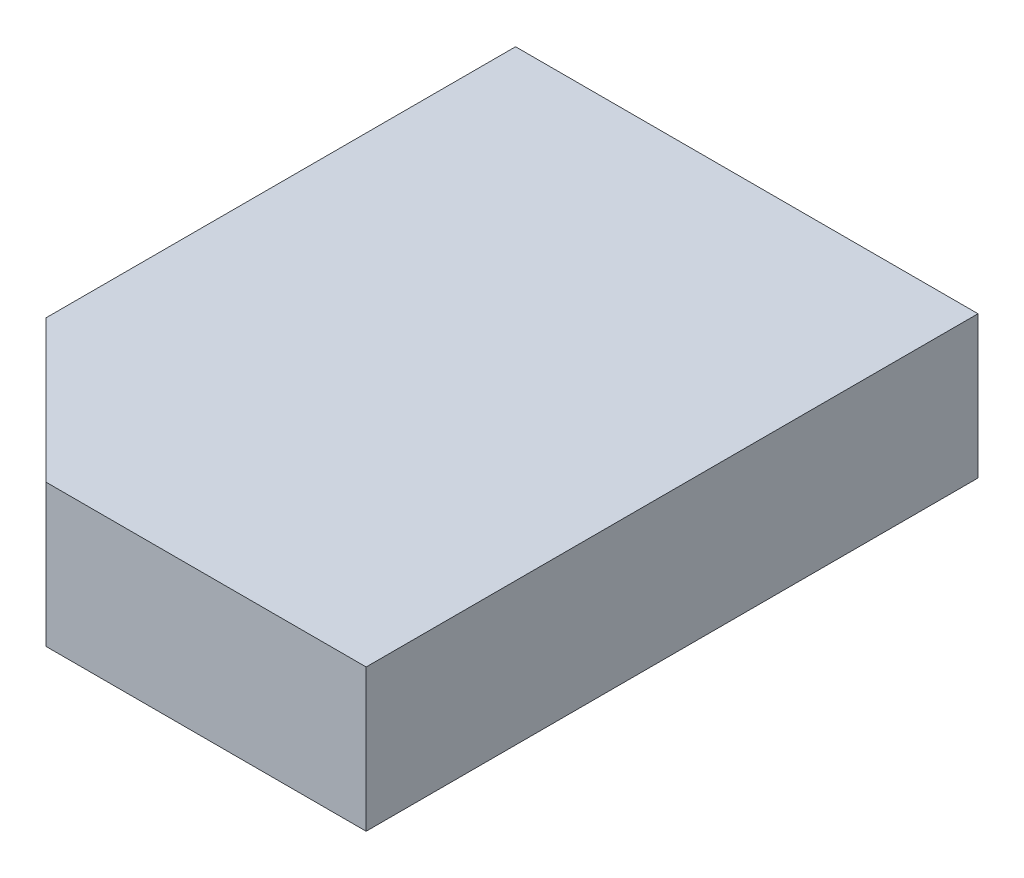
ISO-10303-21;
HEADER;
FILE_DESCRIPTION(('STEP AP214'),'2;1');
FILE_NAME('part.step','',(''),(''),'','','');
FILE_SCHEMA(('AUTOMOTIVE_DESIGN { 1 0 10303 214 1 1 1 1 }'));
ENDSEC;
DATA;
#1=APPLICATION_CONTEXT('core data for automotive mechanical design processes');
#2=APPLICATION_PROTOCOL_DEFINITION('international standard','automotive_design',2000,#1);
#3=PRODUCT_CONTEXT('',#1,'mechanical');
#4=PRODUCT('Part','Part','',(#3));
#5=PRODUCT_RELATED_PRODUCT_CATEGORY('part','',(#4));
#6=PRODUCT_DEFINITION_FORMATION('','',#4);
#7=PRODUCT_DEFINITION_CONTEXT('part definition',#1,'design');
#8=PRODUCT_DEFINITION('design','',#6,#7);
#9=PRODUCT_DEFINITION_SHAPE('','',#8);
#10=(LENGTH_UNIT() NAMED_UNIT(*) SI_UNIT(.MILLI.,.METRE.));
#11=(NAMED_UNIT(*) PLANE_ANGLE_UNIT() SI_UNIT($,.RADIAN.));
#12=(NAMED_UNIT(*) SI_UNIT($,.STERADIAN.) SOLID_ANGLE_UNIT());
#13=UNCERTAINTY_MEASURE_WITH_UNIT(LENGTH_MEASURE(1.E-05),#10,'distance_accuracy_value','');
#14=(GEOMETRIC_REPRESENTATION_CONTEXT(3) GLOBAL_UNCERTAINTY_ASSIGNED_CONTEXT((#13)) GLOBAL_UNIT_ASSIGNED_CONTEXT((#10,
#11,#12)) REPRESENTATION_CONTEXT('',''));
#15=CARTESIAN_POINT('',(0.,0.,0.));
#16=DIRECTION('',(0.,0.,1.));
#17=DIRECTION('',(1.,0.,0.));
#18=AXIS2_PLACEMENT_3D('',#15,#16,#17);
#19=CARTESIAN_POINT('',(5.8552,3.1756,-1.7));
#20=DIRECTION('',(0.,0.,1.));
#21=DIRECTION('',(1.,0.,0.));
#22=AXIS2_PLACEMENT_3D('',#19,#20,#21);
#23=PLANE('',#22);
#24=DIRECTION('',(-1.,0.,0.));
#25=VECTOR('',#24,1.);
#26=CARTESIAN_POINT('',(5.8552,2.9756,-1.7));
#27=LINE('',#26,#25);
#28=CARTESIAN_POINT('',(6.5052,2.9756,-1.7));
#29=VERTEX_POINT('',#28);
#30=CARTESIAN_POINT('',(5.8552,2.9756,-1.7));
#31=VERTEX_POINT('',#30);
#32=EDGE_CURVE('E11',#29,#31,#27,.T.);
#33=ORIENTED_EDGE('',*,*,#32,.T.);
#34=DIRECTION('',(0.,-1.,0.));
#35=VECTOR('',#34,1.);
#36=CARTESIAN_POINT('',(5.8552,3.1756,-1.7));
#37=LINE('',#36,#35);
#38=CARTESIAN_POINT('',(5.8552,3.1756,-1.7));
#39=VERTEX_POINT('',#38);
#40=EDGE_CURVE('E24',#39,#31,#37,.T.);
#41=ORIENTED_EDGE('',*,*,#40,.F.);
#42=DIRECTION('',(-1.,0.,0.));
#43=VECTOR('',#42,1.);
#44=CARTESIAN_POINT('',(5.8552,3.1756,-1.7));
#45=LINE('',#44,#43);
#46=CARTESIAN_POINT('',(6.5052,3.1756,-1.7));
#47=VERTEX_POINT('',#46);
#48=EDGE_CURVE('E102',#47,#39,#45,.T.);
#49=ORIENTED_EDGE('',*,*,#48,.F.);
#50=DIRECTION('',(0.,-1.,0.));
#51=VECTOR('',#50,1.);
#52=CARTESIAN_POINT('',(6.5052,3.1756,-1.7));
#53=LINE('',#52,#51);
#54=EDGE_CURVE('E84',#47,#29,#53,.T.);
#55=ORIENTED_EDGE('',*,*,#54,.T.);
#56=EDGE_LOOP('',(#33,#41,#49,#55));
#57=FACE_BOUND('',#56,.T.);
#58=ADVANCED_FACE('F17',(#57),#23,.F.);
#59=CARTESIAN_POINT('',(5.8552,3.1756,-1.04));
#60=DIRECTION('',(1.,0.,0.));
#61=DIRECTION('',(0.,0.,-1.));
#62=AXIS2_PLACEMENT_3D('',#59,#60,#61);
#63=PLANE('',#62);
#64=DIRECTION('',(0.,0.,1.));
#65=VECTOR('',#64,1.);
#66=CARTESIAN_POINT('',(5.8552,2.9756,-1.04));
#67=LINE('',#66,#65);
#68=CARTESIAN_POINT('',(5.8552,2.9756,-1.04));
#69=VERTEX_POINT('',#68);
#70=EDGE_CURVE('E99',#31,#69,#67,.T.);
#71=ORIENTED_EDGE('',*,*,#70,.T.);
#72=DIRECTION('',(0.,-1.,0.));
#73=VECTOR('',#72,1.);
#74=CARTESIAN_POINT('',(5.8552,3.1756,-1.04));
#75=LINE('',#74,#73);
#76=CARTESIAN_POINT('',(5.8552,3.1756,-1.04));
#77=VERTEX_POINT('',#76);
#78=EDGE_CURVE('E96',#77,#69,#75,.T.);
#79=ORIENTED_EDGE('',*,*,#78,.F.);
#80=DIRECTION('',(0.,0.,1.));
#81=VECTOR('',#80,1.);
#82=CARTESIAN_POINT('',(5.8552,3.1756,-1.04));
#83=LINE('',#82,#81);
#84=EDGE_CURVE('E94',#39,#77,#83,.T.);
#85=ORIENTED_EDGE('',*,*,#84,.F.);
#86=ORIENTED_EDGE('',*,*,#40,.T.);
#87=EDGE_LOOP('',(#71,#79,#85,#86));
#88=FACE_BOUND('',#87,.T.);
#89=ADVANCED_FACE('F105',(#88),#63,.F.);
#90=CARTESIAN_POINT('',(5.8552,3.1756,-1.04));
#91=DIRECTION('',(0.707106781186548,0.,-0.707106781186548));
#92=DIRECTION('',(-0.707106781186548,0.,-0.707106781186548));
#93=AXIS2_PLACEMENT_3D('',#90,#91,#92);
#94=PLANE('',#93);
#95=DIRECTION('',(0.707106781186548,0.,0.707106781186548));
#96=VECTOR('',#95,1.);
#97=CARTESIAN_POINT('',(5.8552,2.9756,-1.04));
#98=LINE('',#97,#96);
#99=CARTESIAN_POINT('',(6.0552,2.9756,-0.840000000000039));
#100=VERTEX_POINT('',#99);
#101=EDGE_CURVE('E92',#69,#100,#98,.T.);
#102=ORIENTED_EDGE('',*,*,#101,.T.);
#103=DIRECTION('',(0.,-1.,0.));
#104=VECTOR('',#103,1.);
#105=CARTESIAN_POINT('',(6.0552,3.1756,-0.840000000000039));
#106=LINE('',#105,#104);
#107=CARTESIAN_POINT('',(6.0552,3.1756,-0.840000000000039));
#108=VERTEX_POINT('',#107);
#109=EDGE_CURVE('E90',#108,#100,#106,.T.);
#110=ORIENTED_EDGE('',*,*,#109,.F.);
#111=DIRECTION('',(0.707106781186548,0.,0.707106781186548));
#112=VECTOR('',#111,1.);
#113=CARTESIAN_POINT('',(5.8552,3.1756,-1.04));
#114=LINE('',#113,#112);
#115=EDGE_CURVE('E79',#77,#108,#114,.T.);
#116=ORIENTED_EDGE('',*,*,#115,.F.);
#117=ORIENTED_EDGE('',*,*,#78,.T.);
#118=EDGE_LOOP('',(#102,#110,#116,#117));
#119=FACE_BOUND('',#118,.T.);
#120=ADVANCED_FACE('F109',(#119),#94,.F.);
#121=CARTESIAN_POINT('',(6.5052,3.1756,-0.840000000000039));
#122=DIRECTION('',(0.,0.,-1.));
#123=DIRECTION('',(-1.,0.,0.));
#124=AXIS2_PLACEMENT_3D('',#121,#122,#123);
#125=PLANE('',#124);
#126=DIRECTION('',(1.,0.,0.));
#127=VECTOR('',#126,1.);
#128=CARTESIAN_POINT('',(6.5052,2.9756,-0.840000000000039));
#129=LINE('',#128,#127);
#130=CARTESIAN_POINT('',(6.5052,2.9756,-0.840000000000039));
#131=VERTEX_POINT('',#130);
#132=EDGE_CURVE('E66',#100,#131,#129,.T.);
#133=ORIENTED_EDGE('',*,*,#132,.T.);
#134=DIRECTION('',(0.,-1.,0.));
#135=VECTOR('',#134,1.);
#136=CARTESIAN_POINT('',(6.5052,3.1756,-0.840000000000039));
#137=LINE('',#136,#135);
#138=CARTESIAN_POINT('',(6.5052,3.1756,-0.840000000000039));
#139=VERTEX_POINT('',#138);
#140=EDGE_CURVE('E60',#139,#131,#137,.T.);
#141=ORIENTED_EDGE('',*,*,#140,.F.);
#142=DIRECTION('',(1.,0.,0.));
#143=VECTOR('',#142,1.);
#144=CARTESIAN_POINT('',(6.5052,3.1756,-0.840000000000039));
#145=LINE('',#144,#143);
#146=EDGE_CURVE('E64',#108,#139,#145,.T.);
#147=ORIENTED_EDGE('',*,*,#146,.F.);
#148=ORIENTED_EDGE('',*,*,#109,.T.);
#149=EDGE_LOOP('',(#133,#141,#147,#148));
#150=FACE_BOUND('',#149,.T.);
#151=ADVANCED_FACE('F62',(#150),#125,.F.);
#152=CARTESIAN_POINT('',(6.5052,3.1756,-1.7));
#153=DIRECTION('',(-1.,0.,0.));
#154=DIRECTION('',(0.,0.,1.));
#155=AXIS2_PLACEMENT_3D('',#152,#153,#154);
#156=PLANE('',#155);
#157=DIRECTION('',(0.,0.,-1.));
#158=VECTOR('',#157,1.);
#159=CARTESIAN_POINT('',(6.5052,2.9756,-1.7));
#160=LINE('',#159,#158);
#161=EDGE_CURVE('E80',#131,#29,#160,.T.);
#162=ORIENTED_EDGE('',*,*,#161,.T.);
#163=ORIENTED_EDGE('',*,*,#54,.F.);
#164=DIRECTION('',(0.,0.,-1.));
#165=VECTOR('',#164,1.);
#166=CARTESIAN_POINT('',(6.5052,3.1756,-1.7));
#167=LINE('',#166,#165);
#168=EDGE_CURVE('E76',#139,#47,#167,.T.);
#169=ORIENTED_EDGE('',*,*,#168,.F.);
#170=ORIENTED_EDGE('',*,*,#140,.T.);
#171=EDGE_LOOP('',(#162,#163,#169,#170));
#172=FACE_BOUND('',#171,.T.);
#173=ADVANCED_FACE('F83',(#172),#156,.F.);
#174=CARTESIAN_POINT('',(6.6802,3.1756,-1.27));
#175=DIRECTION('',(0.,-1.,0.));
#176=DIRECTION('',(0.,0.,-1.));
#177=AXIS2_PLACEMENT_3D('',#174,#175,#176);
#178=PLANE('',#177);
#179=ORIENTED_EDGE('',*,*,#48,.T.);
#180=ORIENTED_EDGE('',*,*,#84,.T.);
#181=ORIENTED_EDGE('',*,*,#115,.T.);
#182=ORIENTED_EDGE('',*,*,#146,.T.);
#183=ORIENTED_EDGE('',*,*,#168,.T.);
#184=EDGE_LOOP('',(#179,#180,#181,#182,#183));
#185=FACE_BOUND('',#184,.T.);
#186=ADVANCED_FACE('F75',(#185),#178,.F.);
#187=CARTESIAN_POINT('',(6.6802,2.9756,-1.27));
#188=DIRECTION('',(0.,-1.,0.));
#189=DIRECTION('',(0.,0.,-1.));
#190=AXIS2_PLACEMENT_3D('',#187,#188,#189);
#191=PLANE('',#190);
#192=ORIENTED_EDGE('',*,*,#32,.F.);
#193=ORIENTED_EDGE('',*,*,#161,.F.);
#194=ORIENTED_EDGE('',*,*,#132,.F.);
#195=ORIENTED_EDGE('',*,*,#101,.F.);
#196=ORIENTED_EDGE('',*,*,#70,.F.);
#197=EDGE_LOOP('',(#192,#193,#194,#195,#196));
#198=FACE_BOUND('',#197,.T.);
#199=ADVANCED_FACE('F107',(#198),#191,.T.);
#200=CLOSED_SHELL('',(#58,#89,#120,#151,#173,#186,#199));
#201=MANIFOLD_SOLID_BREP('B1',#200);
#202=ADVANCED_BREP_SHAPE_REPRESENTATION('',(#18,#201),#14);
#203=SHAPE_DEFINITION_REPRESENTATION(#9,#202);
ENDSEC;
END-ISO-10303-21;
